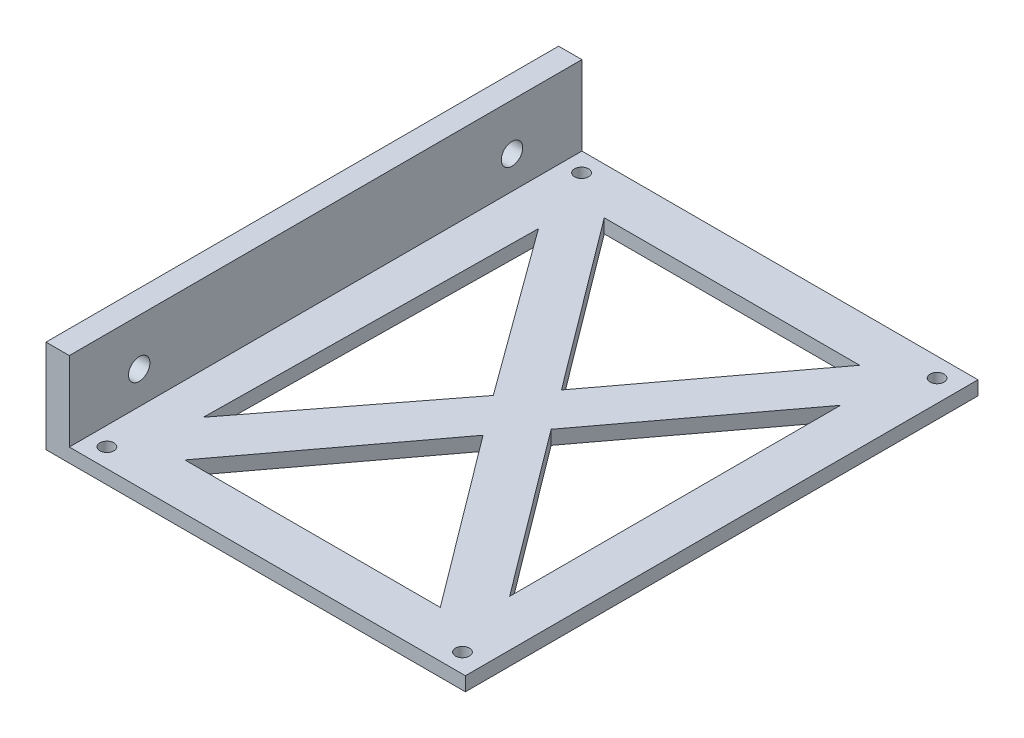
ISO-10303-21;
HEADER;
FILE_DESCRIPTION(('STEP AP214'),'2;1');
FILE_NAME('part.step','',(''),(''),'','','');
FILE_SCHEMA(('AUTOMOTIVE_DESIGN { 1 0 10303 214 1 1 1 1 }'));
ENDSEC;
DATA;
#1=APPLICATION_CONTEXT('core data for automotive mechanical design processes');
#2=APPLICATION_PROTOCOL_DEFINITION('international standard','automotive_design',2000,#1);
#3=PRODUCT_CONTEXT('',#1,'mechanical');
#4=PRODUCT('Part','Part','',(#3));
#5=PRODUCT_RELATED_PRODUCT_CATEGORY('part','',(#4));
#6=PRODUCT_DEFINITION_FORMATION('','',#4);
#7=PRODUCT_DEFINITION_CONTEXT('part definition',#1,'design');
#8=PRODUCT_DEFINITION('design','',#6,#7);
#9=PRODUCT_DEFINITION_SHAPE('','',#8);
#10=(LENGTH_UNIT() NAMED_UNIT(*) SI_UNIT(.MILLI.,.METRE.));
#11=(NAMED_UNIT(*) PLANE_ANGLE_UNIT() SI_UNIT($,.RADIAN.));
#12=(NAMED_UNIT(*) SI_UNIT($,.STERADIAN.) SOLID_ANGLE_UNIT());
#13=UNCERTAINTY_MEASURE_WITH_UNIT(LENGTH_MEASURE(1.E-05),#10,'distance_accuracy_value','');
#14=(GEOMETRIC_REPRESENTATION_CONTEXT(3) GLOBAL_UNCERTAINTY_ASSIGNED_CONTEXT((#13)) GLOBAL_UNIT_ASSIGNED_CONTEXT((#10,
#11,#12)) REPRESENTATION_CONTEXT('',''));
#15=CARTESIAN_POINT('',(0.,0.,0.));
#16=DIRECTION('',(0.,0.,1.));
#17=DIRECTION('',(1.,0.,0.));
#18=AXIS2_PLACEMENT_3D('',#15,#16,#17);
#19=CARTESIAN_POINT('',(5.,0.,0.));
#20=DIRECTION('',(-1.,0.,0.));
#21=DIRECTION('',(0.,0.,1.));
#22=AXIS2_PLACEMENT_3D('',#19,#20,#21);
#23=PLANE('',#22);
#24=CARTESIAN_POINT('',(5.,0.,-40.));
#25=DIRECTION('',(-1.,0.,0.));
#26=DIRECTION('',(0.,0.,1.));
#27=AXIS2_PLACEMENT_3D('',#24,#25,#26);
#28=CIRCLE('',#27,2.29999999999999);
#29=CARTESIAN_POINT('',(5.,0.,-37.7));
#30=VERTEX_POINT('',#29);
#31=EDGE_CURVE('E285',#30,#30,#28,.F.);
#32=ORIENTED_EDGE('',*,*,#31,.F.);
#33=EDGE_LOOP('',(#32));
#34=FACE_BOUND('',#33,.T.);
#35=CARTESIAN_POINT('',(5.,0.,40.));
#36=DIRECTION('',(-1.,0.,0.));
#37=DIRECTION('',(0.,0.,1.));
#38=AXIS2_PLACEMENT_3D('',#35,#36,#37);
#39=CIRCLE('',#38,2.29999999999999);
#40=CARTESIAN_POINT('',(5.,0.,42.3));
#41=VERTEX_POINT('',#40);
#42=EDGE_CURVE('E279',#41,#41,#39,.F.);
#43=ORIENTED_EDGE('',*,*,#42,.F.);
#44=EDGE_LOOP('',(#43));
#45=FACE_BOUND('',#44,.T.);
#46=DIRECTION('',(0.,0.,1.));
#47=VECTOR('',#46,1.);
#48=CARTESIAN_POINT('',(5.,-7.,-55.));
#49=LINE('',#48,#47);
#50=CARTESIAN_POINT('',(5.,-7.,-55.));
#51=VERTEX_POINT('',#50);
#52=CARTESIAN_POINT('',(5.00000000000001,-7.,55.));
#53=VERTEX_POINT('',#52);
#54=EDGE_CURVE('E289',#51,#53,#49,.T.);
#55=ORIENTED_EDGE('',*,*,#54,.F.);
#56=DIRECTION('',(0.,1.,0.));
#57=VECTOR('',#56,1.);
#58=CARTESIAN_POINT('',(5.,-10.,-55.));
#59=LINE('',#58,#57);
#60=CARTESIAN_POINT('',(5.,10.,-55.));
#61=VERTEX_POINT('',#60);
#62=EDGE_CURVE('E308',#51,#61,#59,.T.);
#63=ORIENTED_EDGE('',*,*,#62,.T.);
#64=DIRECTION('',(0.,0.,1.));
#65=VECTOR('',#64,1.);
#66=CARTESIAN_POINT('',(5.,10.,55.));
#67=LINE('',#66,#65);
#68=CARTESIAN_POINT('',(5.,10.,55.));
#69=VERTEX_POINT('',#68);
#70=EDGE_CURVE('E310',#61,#69,#67,.T.);
#71=ORIENTED_EDGE('',*,*,#70,.T.);
#72=DIRECTION('',(0.,-1.,0.));
#73=VECTOR('',#72,1.);
#74=CARTESIAN_POINT('',(5.,-10.,55.));
#75=LINE('',#74,#73);
#76=EDGE_CURVE('E313',#69,#53,#75,.T.);
#77=ORIENTED_EDGE('',*,*,#76,.T.);
#78=EDGE_LOOP('',(#55,#63,#71,#77));
#79=FACE_BOUND('',#78,.T.);
#80=ADVANCED_FACE('F33',(#34,#45,#79),#23,.F.);
#81=CARTESIAN_POINT('',(5.,-10.,-55.));
#82=DIRECTION('',(0.,0.,1.));
#83=DIRECTION('',(1.,0.,0.));
#84=AXIS2_PLACEMENT_3D('',#81,#82,#83);
#85=PLANE('',#84);
#86=DIRECTION('',(0.,1.,0.));
#87=VECTOR('',#86,1.);
#88=CARTESIAN_POINT('',(0.,-10.,-55.));
#89=LINE('',#88,#87);
#90=CARTESIAN_POINT('',(0.,-10.,-55.));
#91=VERTEX_POINT('',#90);
#92=CARTESIAN_POINT('',(0.,10.,-55.));
#93=VERTEX_POINT('',#92);
#94=EDGE_CURVE('E307',#91,#93,#89,.T.);
#95=ORIENTED_EDGE('',*,*,#94,.T.);
#96=DIRECTION('',(-1.,0.,0.));
#97=VECTOR('',#96,1.);
#98=CARTESIAN_POINT('',(5.,10.,-55.));
#99=LINE('',#98,#97);
#100=EDGE_CURVE('E11',#61,#93,#99,.T.);
#101=ORIENTED_EDGE('',*,*,#100,.F.);
#102=ORIENTED_EDGE('',*,*,#62,.F.);
#103=DIRECTION('',(-1.,0.,0.));
#104=VECTOR('',#103,1.);
#105=CARTESIAN_POINT('',(5.,-7.,-55.));
#106=LINE('',#105,#104);
#107=CARTESIAN_POINT('',(90.,-7.,-55.));
#108=VERTEX_POINT('',#107);
#109=EDGE_CURVE('E296',#108,#51,#106,.T.);
#110=ORIENTED_EDGE('',*,*,#109,.F.);
#111=DIRECTION('',(0.,-1.,0.));
#112=VECTOR('',#111,1.);
#113=CARTESIAN_POINT('',(90.,-7.,-55.));
#114=LINE('',#113,#112);
#115=CARTESIAN_POINT('',(90.,-10.,-55.));
#116=VERTEX_POINT('',#115);
#117=EDGE_CURVE('E299',#108,#116,#114,.T.);
#118=ORIENTED_EDGE('',*,*,#117,.T.);
#119=DIRECTION('',(-1.,0.,0.));
#120=VECTOR('',#119,1.);
#121=CARTESIAN_POINT('',(5.,-10.,-55.));
#122=LINE('',#121,#120);
#123=EDGE_CURVE('E315',#116,#91,#122,.T.);
#124=ORIENTED_EDGE('',*,*,#123,.T.);
#125=EDGE_LOOP('',(#95,#101,#102,#110,#118,#124));
#126=FACE_BOUND('',#125,.T.);
#127=ADVANCED_FACE('F35',(#126),#85,.F.);
#128=CARTESIAN_POINT('',(5.,10.,55.));
#129=DIRECTION('',(0.,-1.,0.));
#130=DIRECTION('',(0.,0.,-1.));
#131=AXIS2_PLACEMENT_3D('',#128,#129,#130);
#132=PLANE('',#131);
#133=DIRECTION('',(0.,0.,1.));
#134=VECTOR('',#133,1.);
#135=CARTESIAN_POINT('',(0.,10.,55.));
#136=LINE('',#135,#134);
#137=CARTESIAN_POINT('',(0.,10.,55.));
#138=VERTEX_POINT('',#137);
#139=EDGE_CURVE('E318',#93,#138,#136,.T.);
#140=ORIENTED_EDGE('',*,*,#139,.T.);
#141=DIRECTION('',(-1.,0.,0.));
#142=VECTOR('',#141,1.);
#143=CARTESIAN_POINT('',(5.,10.,55.));
#144=LINE('',#143,#142);
#145=EDGE_CURVE('E42',#69,#138,#144,.T.);
#146=ORIENTED_EDGE('',*,*,#145,.F.);
#147=ORIENTED_EDGE('',*,*,#70,.F.);
#148=ORIENTED_EDGE('',*,*,#100,.T.);
#149=EDGE_LOOP('',(#140,#146,#147,#148));
#150=FACE_BOUND('',#149,.T.);
#151=ADVANCED_FACE('F366',(#150),#132,.F.);
#152=CARTESIAN_POINT('',(5.,-10.,55.));
#153=DIRECTION('',(0.,0.,-1.));
#154=DIRECTION('',(-1.,0.,0.));
#155=AXIS2_PLACEMENT_3D('',#152,#153,#154);
#156=PLANE('',#155);
#157=DIRECTION('',(0.,-1.,0.));
#158=VECTOR('',#157,1.);
#159=CARTESIAN_POINT('',(0.,-10.,55.));
#160=LINE('',#159,#158);
#161=CARTESIAN_POINT('',(0.,-10.,55.));
#162=VERTEX_POINT('',#161);
#163=EDGE_CURVE('E320',#138,#162,#160,.T.);
#164=ORIENTED_EDGE('',*,*,#163,.T.);
#165=DIRECTION('',(-1.,0.,0.));
#166=VECTOR('',#165,1.);
#167=CARTESIAN_POINT('',(5.,-10.,55.));
#168=LINE('',#167,#166);
#169=CARTESIAN_POINT('',(90.,-10.,55.));
#170=VERTEX_POINT('',#169);
#171=EDGE_CURVE('E325',#170,#162,#168,.T.);
#172=ORIENTED_EDGE('',*,*,#171,.F.);
#173=DIRECTION('',(0.,-1.,0.));
#174=VECTOR('',#173,1.);
#175=CARTESIAN_POINT('',(90.,-7.,55.));
#176=LINE('',#175,#174);
#177=CARTESIAN_POINT('',(90.,-7.,55.));
#178=VERTEX_POINT('',#177);
#179=EDGE_CURVE('E304',#178,#170,#176,.T.);
#180=ORIENTED_EDGE('',*,*,#179,.F.);
#181=DIRECTION('',(1.,0.,0.));
#182=VECTOR('',#181,1.);
#183=CARTESIAN_POINT('',(5.00000000000001,-7.,55.));
#184=LINE('',#183,#182);
#185=EDGE_CURVE('E292',#53,#178,#184,.T.);
#186=ORIENTED_EDGE('',*,*,#185,.F.);
#187=ORIENTED_EDGE('',*,*,#76,.F.);
#188=ORIENTED_EDGE('',*,*,#145,.T.);
#189=EDGE_LOOP('',(#164,#172,#180,#186,#187,#188));
#190=FACE_BOUND('',#189,.T.);
#191=ADVANCED_FACE('F370',(#190),#156,.F.);
#192=CARTESIAN_POINT('',(5.,-10.,55.));
#193=DIRECTION('',(0.,1.,0.));
#194=DIRECTION('',(0.,0.,1.));
#195=AXIS2_PLACEMENT_3D('',#192,#193,#194);
#196=PLANE('',#195);
#197=DIRECTION('',(0.599559865294037,0.,-0.800329911929197));
#198=VECTOR('',#197,1.);
#199=CARTESIAN_POINT('',(1.60509110825612,-10.,52.4567349195871));
#200=LINE('',#199,#198);
#201=CARTESIAN_POINT('',(47.2035238953294,-10.,-8.41089783746939));
#202=VERTEX_POINT('',#201);
#203=CARTESIAN_POINT('',(74.6139165806616,-10.,-45.));
#204=VERTEX_POINT('',#203);
#205=EDGE_CURVE('E257',#202,#204,#200,.T.);
#206=ORIENTED_EDGE('',*,*,#205,.T.);
#207=DIRECTION('',(-1.,0.,0.));
#208=VECTOR('',#207,1.);
#209=CARTESIAN_POINT('',(4.99999999999999,-10.,-45.));
#210=LINE('',#209,#208);
#211=CARTESIAN_POINT('',(19.7931312099972,-10.,-45.));
#212=VERTEX_POINT('',#211);
#213=EDGE_CURVE('E260',#204,#212,#210,.T.);
#214=ORIENTED_EDGE('',*,*,#213,.T.);
#215=DIRECTION('',(0.599559865294037,0.,0.800329911929197));
#216=VECTOR('',#215,1.);
#217=CARTESIAN_POINT('',(62.4599836919464,-10.,11.9543764781983));
#218=LINE('',#217,#216);
#219=EDGE_CURVE('E254',#212,#202,#218,.T.);
#220=ORIENTED_EDGE('',*,*,#219,.T.);
#221=EDGE_LOOP('',(#206,#214,#220));
#222=FACE_BOUND('',#221,.T.);
#223=DIRECTION('',(0.609696912452385,0.,-0.792634641525356));
#224=VECTOR('',#223,1.);
#225=CARTESIAN_POINT('',(0.938714441103689,-10.,51.8760471267299));
#226=LINE('',#225,#224);
#227=CARTESIAN_POINT('',(13.8507234089315,-10.,35.0898286129767));
#228=VERTEX_POINT('',#227);
#229=CARTESIAN_POINT('',(40.9030823436684,-10.,-0.079509444520881));
#230=VERTEX_POINT('',#229);
#231=EDGE_CURVE('E248',#228,#230,#226,.T.);
#232=ORIENTED_EDGE('',*,*,#231,.T.);
#233=DIRECTION('',(-0.589325703280344,0.,-0.807895547365579));
#234=VECTOR('',#233,1.);
#235=CARTESIAN_POINT('',(54.6578742340768,-10.,18.7766766361919));
#236=LINE('',#235,#234);
#237=CARTESIAN_POINT('',(14.7545975326171,-10.,-35.9259765706214));
#238=VERTEX_POINT('',#237);
#239=EDGE_CURVE('E251',#230,#238,#236,.T.);
#240=ORIENTED_EDGE('',*,*,#239,.T.);
#241=DIRECTION('',(-0.0127267573461906,0.,0.999919011544161));
#242=VECTOR('',#241,1.);
#243=CARTESIAN_POINT('',(13.5959184559973,-10.,55.1094070290635));
#244=LINE('',#243,#242);
#245=EDGE_CURVE('E245',#238,#228,#244,.T.);
#246=ORIENTED_EDGE('',*,*,#245,.T.);
#247=EDGE_LOOP('',(#232,#240,#246));
#248=FACE_BOUND('',#247,.T.);
#249=DIRECTION('',(-0.599559865294037,0.,-0.800329911929197));
#250=VECTOR('',#249,1.);
#251=CARTESIAN_POINT('',(54.3881174688325,-10.,18.0013415525585));
#252=LINE('',#251,#250);
#253=CARTESIAN_POINT('',(74.6139165806616,-10.,45.));
#254=VERTEX_POINT('',#253);
#255=CARTESIAN_POINT('',(47.2035238953294,-10.,8.41089783746943));
#256=VERTEX_POINT('',#255);
#257=EDGE_CURVE('E168',#254,#256,#252,.T.);
#258=ORIENTED_EDGE('',*,*,#257,.T.);
#259=DIRECTION('',(-0.599559865294037,0.,0.800329911929197));
#260=VECTOR('',#259,1.);
#261=CARTESIAN_POINT('',(9.67695733136999,-10.,58.5036999939473));
#262=LINE('',#261,#260);
#263=CARTESIAN_POINT('',(19.7931312099972,-10.,45.));
#264=VERTEX_POINT('',#263);
#265=EDGE_CURVE('E242',#256,#264,#262,.T.);
#266=ORIENTED_EDGE('',*,*,#265,.T.);
#267=DIRECTION('',(1.,0.,0.));
#268=VECTOR('',#267,1.);
#269=CARTESIAN_POINT('',(5.,-10.,45.));
#270=LINE('',#269,#268);
#271=EDGE_CURVE('E239',#264,#254,#270,.T.);
#272=ORIENTED_EDGE('',*,*,#271,.T.);
#273=EDGE_LOOP('',(#258,#266,#272));
#274=FACE_BOUND('',#273,.T.);
#275=DIRECTION('',(0.599559865294037,0.,0.800329911929197));
#276=VECTOR('',#275,1.);
#277=CARTESIAN_POINT('',(62.3914165881245,-10.,12.0057428996181));
#278=LINE('',#277,#276);
#279=CARTESIAN_POINT('',(53.397423625524,-10.,0.));
#280=VERTEX_POINT('',#279);
#281=CARTESIAN_POINT('',(80.,-10.,35.5107785549199));
#282=VERTEX_POINT('',#281);
#283=EDGE_CURVE('E233',#280,#282,#278,.T.);
#284=ORIENTED_EDGE('',*,*,#283,.T.);
#285=DIRECTION('',(0.,0.,-1.));
#286=VECTOR('',#285,1.);
#287=CARTESIAN_POINT('',(80.,-10.,55.));
#288=LINE('',#287,#286);
#289=CARTESIAN_POINT('',(80.,-10.,-35.5107785549198));
#290=VERTEX_POINT('',#289);
#291=EDGE_CURVE('E236',#282,#290,#288,.T.);
#292=ORIENTED_EDGE('',*,*,#291,.T.);
#293=DIRECTION('',(-0.599559865294038,0.,0.800329911929197));
#294=VECTOR('',#293,1.);
#295=CARTESIAN_POINT('',(9.60839022754808,-10.,58.4523335725275));
#296=LINE('',#295,#294);
#297=EDGE_CURVE('E226',#290,#280,#296,.T.);
#298=ORIENTED_EDGE('',*,*,#297,.T.);
#299=EDGE_LOOP('',(#284,#292,#298));
#300=FACE_BOUND('',#299,.T.);
#301=CARTESIAN_POINT('',(8.99999999999999,-10.,-50.925));
#302=DIRECTION('',(0.,-1.,0.));
#303=DIRECTION('',(0.,0.,-1.));
#304=AXIS2_PLACEMENT_3D('',#301,#302,#303);
#305=CIRCLE('',#304,1.4987948959022);
#306=CARTESIAN_POINT('',(8.99999999999999,-10.,-52.4237948959022));
#307=VERTEX_POINT('',#306);
#308=EDGE_CURVE('E263',#307,#307,#305,.T.);
#309=ORIENTED_EDGE('',*,*,#308,.F.);
#310=EDGE_LOOP('',(#309));
#311=FACE_BOUND('',#310,.T.);
#312=CARTESIAN_POINT('',(85.3,-10.,-50.925));
#313=DIRECTION('',(0.,-1.,0.));
#314=DIRECTION('',(0.,0.,-1.));
#315=AXIS2_PLACEMENT_3D('',#312,#313,#314);
#316=CIRCLE('',#315,1.4987948959022);
#317=CARTESIAN_POINT('',(85.3,-10.,-52.4237948959022));
#318=VERTEX_POINT('',#317);
#319=EDGE_CURVE('E268',#318,#318,#316,.T.);
#320=ORIENTED_EDGE('',*,*,#319,.F.);
#321=EDGE_LOOP('',(#320));
#322=FACE_BOUND('',#321,.T.);
#323=CARTESIAN_POINT('',(85.3,-10.,50.925));
#324=DIRECTION('',(0.,-1.,0.));
#325=DIRECTION('',(0.,0.,-1.));
#326=AXIS2_PLACEMENT_3D('',#323,#324,#325);
#327=CIRCLE('',#326,1.4987948959022);
#328=CARTESIAN_POINT('',(85.3,-10.,49.4262051040978));
#329=VERTEX_POINT('',#328);
#330=EDGE_CURVE('E264',#329,#329,#327,.T.);
#331=ORIENTED_EDGE('',*,*,#330,.F.);
#332=EDGE_LOOP('',(#331));
#333=FACE_BOUND('',#332,.T.);
#334=CARTESIAN_POINT('',(8.99999999999999,-10.,50.925));
#335=DIRECTION('',(0.,-1.,0.));
#336=DIRECTION('',(0.,0.,-1.));
#337=AXIS2_PLACEMENT_3D('',#334,#335,#336);
#338=CIRCLE('',#337,1.4987948959022);
#339=CARTESIAN_POINT('',(8.99999999999999,-10.,49.4262051040978));
#340=VERTEX_POINT('',#339);
#341=EDGE_CURVE('E267',#340,#340,#338,.T.);
#342=ORIENTED_EDGE('',*,*,#341,.F.);
#343=EDGE_LOOP('',(#342));
#344=FACE_BOUND('',#343,.T.);
#345=DIRECTION('',(0.,0.,-1.));
#346=VECTOR('',#345,1.);
#347=CARTESIAN_POINT('',(0.,-10.,55.));
#348=LINE('',#347,#346);
#349=EDGE_CURVE('E311',#162,#91,#348,.T.);
#350=ORIENTED_EDGE('',*,*,#349,.T.);
#351=ORIENTED_EDGE('',*,*,#123,.F.);
#352=DIRECTION('',(0.,0.,-1.));
#353=VECTOR('',#352,1.);
#354=CARTESIAN_POINT('',(90.,-10.,-55.));
#355=LINE('',#354,#353);
#356=EDGE_CURVE('E288',#170,#116,#355,.T.);
#357=ORIENTED_EDGE('',*,*,#356,.F.);
#358=ORIENTED_EDGE('',*,*,#171,.T.);
#359=EDGE_LOOP('',(#350,#351,#357,#358));
#360=FACE_BOUND('',#359,.T.);
#361=ADVANCED_FACE('F379',(#222,#248,#274,#300,#311,#322,#333,#344,#360),#196,.F.);
#362=CARTESIAN_POINT('',(0.,0.,0.));
#363=DIRECTION('',(-1.,0.,0.));
#364=DIRECTION('',(0.,0.,1.));
#365=AXIS2_PLACEMENT_3D('',#362,#363,#364);
#366=PLANE('',#365);
#367=CARTESIAN_POINT('',(0.,0.,-40.));
#368=DIRECTION('',(1.,0.,0.));
#369=DIRECTION('',(0.,0.,-1.));
#370=AXIS2_PLACEMENT_3D('',#367,#368,#369);
#371=CIRCLE('',#370,2.29999999999999);
#372=CARTESIAN_POINT('',(0.,0.,-42.3));
#373=VERTEX_POINT('',#372);
#374=EDGE_CURVE('E276',#373,#373,#371,.T.);
#375=ORIENTED_EDGE('',*,*,#374,.T.);
#376=EDGE_LOOP('',(#375));
#377=FACE_BOUND('',#376,.T.);
#378=CARTESIAN_POINT('',(0.,0.,40.));
#379=DIRECTION('',(1.,0.,0.));
#380=DIRECTION('',(0.,0.,-1.));
#381=AXIS2_PLACEMENT_3D('',#378,#379,#380);
#382=CIRCLE('',#381,2.29999999999999);
#383=CARTESIAN_POINT('',(0.,0.,37.7));
#384=VERTEX_POINT('',#383);
#385=EDGE_CURVE('E280',#384,#384,#382,.T.);
#386=ORIENTED_EDGE('',*,*,#385,.T.);
#387=EDGE_LOOP('',(#386));
#388=FACE_BOUND('',#387,.T.);
#389=ORIENTED_EDGE('',*,*,#94,.F.);
#390=ORIENTED_EDGE('',*,*,#349,.F.);
#391=ORIENTED_EDGE('',*,*,#163,.F.);
#392=ORIENTED_EDGE('',*,*,#139,.F.);
#393=EDGE_LOOP('',(#389,#390,#391,#392));
#394=FACE_BOUND('',#393,.T.);
#395=ADVANCED_FACE('F378',(#377,#388,#394),#366,.T.);
#396=CARTESIAN_POINT('',(90.,-7.,-55.));
#397=DIRECTION('',(-1.,0.,0.));
#398=DIRECTION('',(0.,0.,1.));
#399=AXIS2_PLACEMENT_3D('',#396,#397,#398);
#400=PLANE('',#399);
#401=ORIENTED_EDGE('',*,*,#356,.T.);
#402=ORIENTED_EDGE('',*,*,#117,.F.);
#403=DIRECTION('',(0.,0.,-1.));
#404=VECTOR('',#403,1.);
#405=CARTESIAN_POINT('',(90.,-7.,-55.));
#406=LINE('',#405,#404);
#407=EDGE_CURVE('E294',#178,#108,#406,.T.);
#408=ORIENTED_EDGE('',*,*,#407,.F.);
#409=ORIENTED_EDGE('',*,*,#179,.T.);
#410=EDGE_LOOP('',(#401,#402,#408,#409));
#411=FACE_BOUND('',#410,.T.);
#412=ADVANCED_FACE('F347',(#411),#400,.F.);
#413=CARTESIAN_POINT('',(0.,-7.,0.));
#414=DIRECTION('',(0.,1.,0.));
#415=DIRECTION('',(0.,0.,1.));
#416=AXIS2_PLACEMENT_3D('',#413,#414,#415);
#417=PLANE('',#416);
#418=DIRECTION('',(-1.,0.,0.));
#419=VECTOR('',#418,1.);
#420=CARTESIAN_POINT('',(74.6139165806616,-7.,-45.));
#421=LINE('',#420,#419);
#422=CARTESIAN_POINT('',(74.6139165806616,-7.,-45.));
#423=VERTEX_POINT('',#422);
#424=CARTESIAN_POINT('',(19.7931312099972,-7.,-45.));
#425=VERTEX_POINT('',#424);
#426=EDGE_CURVE('E188',#423,#425,#421,.T.);
#427=ORIENTED_EDGE('',*,*,#426,.F.);
#428=DIRECTION('',(0.599559865294037,0.,-0.800329911929197));
#429=VECTOR('',#428,1.);
#430=CARTESIAN_POINT('',(47.2035238953294,-7.,-8.41089783746939));
#431=LINE('',#430,#429);
#432=CARTESIAN_POINT('',(47.2035238953294,-7.,-8.41089783746939));
#433=VERTEX_POINT('',#432);
#434=EDGE_CURVE('E193',#433,#423,#431,.T.);
#435=ORIENTED_EDGE('',*,*,#434,.F.);
#436=DIRECTION('',(0.599559865294037,0.,0.800329911929197));
#437=VECTOR('',#436,1.);
#438=CARTESIAN_POINT('',(19.7931312099972,-7.,-45.));
#439=LINE('',#438,#437);
#440=EDGE_CURVE('E191',#425,#433,#439,.T.);
#441=ORIENTED_EDGE('',*,*,#440,.F.);
#442=EDGE_LOOP('',(#427,#435,#441));
#443=FACE_BOUND('',#442,.T.);
#444=DIRECTION('',(-0.589325703280343,0.,-0.807895547365579));
#445=VECTOR('',#444,1.);
#446=CARTESIAN_POINT('',(14.7545975326171,-7.,-35.9259765706214));
#447=LINE('',#446,#445);
#448=CARTESIAN_POINT('',(40.9030823436684,-7.,-0.079509444520881));
#449=VERTEX_POINT('',#448);
#450=CARTESIAN_POINT('',(14.7545975326171,-7.,-35.9259765706214));
#451=VERTEX_POINT('',#450);
#452=EDGE_CURVE('E199',#449,#451,#447,.T.);
#453=ORIENTED_EDGE('',*,*,#452,.F.);
#454=DIRECTION('',(0.609696912452385,0.,-0.792634641525356));
#455=VECTOR('',#454,1.);
#456=CARTESIAN_POINT('',(40.9030823436684,-7.,-0.079509444520881));
#457=LINE('',#456,#455);
#458=CARTESIAN_POINT('',(13.8507234089315,-7.,35.0898286129767));
#459=VERTEX_POINT('',#458);
#460=EDGE_CURVE('E206',#459,#449,#457,.T.);
#461=ORIENTED_EDGE('',*,*,#460,.F.);
#462=DIRECTION('',(-0.0127267573461906,0.,0.999919011544161));
#463=VECTOR('',#462,1.);
#464=CARTESIAN_POINT('',(13.8507234089315,-7.,35.0898286129767));
#465=LINE('',#464,#463);
#466=EDGE_CURVE('E204',#451,#459,#465,.T.);
#467=ORIENTED_EDGE('',*,*,#466,.F.);
#468=EDGE_LOOP('',(#453,#461,#467));
#469=FACE_BOUND('',#468,.T.);
#470=DIRECTION('',(-0.599559865294037,0.,0.800329911929197));
#471=VECTOR('',#470,1.);
#472=CARTESIAN_POINT('',(19.7931312099972,-7.,45.));
#473=LINE('',#472,#471);
#474=CARTESIAN_POINT('',(47.2035238953294,-7.,8.41089783746943));
#475=VERTEX_POINT('',#474);
#476=CARTESIAN_POINT('',(19.7931312099972,-7.,45.));
#477=VERTEX_POINT('',#476);
#478=EDGE_CURVE('E180',#475,#477,#473,.T.);
#479=ORIENTED_EDGE('',*,*,#478,.F.);
#480=DIRECTION('',(-0.599559865294037,0.,-0.800329911929197));
#481=VECTOR('',#480,1.);
#482=CARTESIAN_POINT('',(47.2035238953294,-7.,8.41089783746943));
#483=LINE('',#482,#481);
#484=CARTESIAN_POINT('',(74.6139165806616,-7.,45.));
#485=VERTEX_POINT('',#484);
#486=EDGE_CURVE('E165',#485,#475,#483,.T.);
#487=ORIENTED_EDGE('',*,*,#486,.F.);
#488=DIRECTION('',(1.,0.,0.));
#489=VECTOR('',#488,1.);
#490=CARTESIAN_POINT('',(74.6139165806616,-7.,45.));
#491=LINE('',#490,#489);
#492=EDGE_CURVE('E176',#477,#485,#491,.T.);
#493=ORIENTED_EDGE('',*,*,#492,.F.);
#494=EDGE_LOOP('',(#479,#487,#493));
#495=FACE_BOUND('',#494,.T.);
#496=DIRECTION('',(0.,0.,-1.));
#497=VECTOR('',#496,1.);
#498=CARTESIAN_POINT('',(80.,-7.,35.5107785549199));
#499=LINE('',#498,#497);
#500=CARTESIAN_POINT('',(80.,-7.,35.5107785549199));
#501=VERTEX_POINT('',#500);
#502=CARTESIAN_POINT('',(80.,-7.,-35.5107785549198));
#503=VERTEX_POINT('',#502);
#504=EDGE_CURVE('E212',#501,#503,#499,.T.);
#505=ORIENTED_EDGE('',*,*,#504,.F.);
#506=DIRECTION('',(0.599559865294037,0.,0.800329911929197));
#507=VECTOR('',#506,1.);
#508=CARTESIAN_POINT('',(53.397423625524,-7.,0.));
#509=LINE('',#508,#507);
#510=CARTESIAN_POINT('',(53.397423625524,-7.,0.));
#511=VERTEX_POINT('',#510);
#512=EDGE_CURVE('E220',#511,#501,#509,.T.);
#513=ORIENTED_EDGE('',*,*,#512,.F.);
#514=DIRECTION('',(-0.599559865294038,0.,0.800329911929197));
#515=VECTOR('',#514,1.);
#516=CARTESIAN_POINT('',(80.,-7.,-35.5107785549198));
#517=LINE('',#516,#515);
#518=EDGE_CURVE('E217',#503,#511,#517,.T.);
#519=ORIENTED_EDGE('',*,*,#518,.F.);
#520=EDGE_LOOP('',(#505,#513,#519));
#521=FACE_BOUND('',#520,.T.);
#522=CARTESIAN_POINT('',(8.99999999999999,-7.,-50.925));
#523=DIRECTION('',(0.,1.,0.));
#524=DIRECTION('',(0.,0.,1.));
#525=AXIS2_PLACEMENT_3D('',#522,#523,#524);
#526=CIRCLE('',#525,1.4987948959022);
#527=CARTESIAN_POINT('',(8.99999999999999,-7.,-49.4262051040978));
#528=VERTEX_POINT('',#527);
#529=EDGE_CURVE('E37',#528,#528,#526,.T.);
#530=ORIENTED_EDGE('',*,*,#529,.F.);
#531=EDGE_LOOP('',(#530));
#532=FACE_BOUND('',#531,.T.);
#533=CARTESIAN_POINT('',(85.3,-7.,-50.925));
#534=DIRECTION('',(0.,1.,0.));
#535=DIRECTION('',(0.,0.,1.));
#536=AXIS2_PLACEMENT_3D('',#533,#534,#535);
#537=CIRCLE('',#536,1.4987948959022);
#538=CARTESIAN_POINT('',(85.3,-7.,-49.4262051040978));
#539=VERTEX_POINT('',#538);
#540=EDGE_CURVE('E334',#539,#539,#537,.T.);
#541=ORIENTED_EDGE('',*,*,#540,.F.);
#542=EDGE_LOOP('',(#541));
#543=FACE_BOUND('',#542,.T.);
#544=CARTESIAN_POINT('',(85.3,-7.,50.925));
#545=DIRECTION('',(0.,1.,0.));
#546=DIRECTION('',(0.,0.,1.));
#547=AXIS2_PLACEMENT_3D('',#544,#545,#546);
#548=CIRCLE('',#547,1.4987948959022);
#549=CARTESIAN_POINT('',(85.3,-7.,52.4237948959022));
#550=VERTEX_POINT('',#549);
#551=EDGE_CURVE('E332',#550,#550,#548,.T.);
#552=ORIENTED_EDGE('',*,*,#551,.F.);
#553=EDGE_LOOP('',(#552));
#554=FACE_BOUND('',#553,.T.);
#555=CARTESIAN_POINT('',(8.99999999999999,-7.,50.925));
#556=DIRECTION('',(0.,1.,0.));
#557=DIRECTION('',(0.,0.,1.));
#558=AXIS2_PLACEMENT_3D('',#555,#556,#557);
#559=CIRCLE('',#558,1.4987948959022);
#560=CARTESIAN_POINT('',(8.99999999999999,-7.,52.4237948959022));
#561=VERTEX_POINT('',#560);
#562=EDGE_CURVE('E275',#561,#561,#559,.T.);
#563=ORIENTED_EDGE('',*,*,#562,.F.);
#564=EDGE_LOOP('',(#563));
#565=FACE_BOUND('',#564,.T.);
#566=ORIENTED_EDGE('',*,*,#54,.T.);
#567=ORIENTED_EDGE('',*,*,#185,.T.);
#568=ORIENTED_EDGE('',*,*,#407,.T.);
#569=ORIENTED_EDGE('',*,*,#109,.T.);
#570=EDGE_LOOP('',(#566,#567,#568,#569));
#571=FACE_BOUND('',#570,.T.);
#572=ADVANCED_FACE('F182',(#443,#469,#495,#521,#532,#543,#554,#565,#571),#417,.T.);
#573=CARTESIAN_POINT('',(10.,0.,40.));
#574=DIRECTION('',(-1.,0.,0.));
#575=DIRECTION('',(0.,0.,1.));
#576=AXIS2_PLACEMENT_3D('',#573,#574,#575);
#577=CYLINDRICAL_SURFACE('',#576,2.29999999999999);
#578=ORIENTED_EDGE('',*,*,#385,.F.);
#579=EDGE_LOOP('',(#578));
#580=FACE_BOUND('',#579,.T.);
#581=ORIENTED_EDGE('',*,*,#42,.T.);
#582=EDGE_LOOP('',(#581));
#583=FACE_BOUND('',#582,.T.);
#584=ADVANCED_FACE('F346',(#580,#583),#577,.F.);
#585=CARTESIAN_POINT('',(10.,0.,-40.));
#586=DIRECTION('',(-1.,0.,0.));
#587=DIRECTION('',(0.,0.,1.));
#588=AXIS2_PLACEMENT_3D('',#585,#586,#587);
#589=CYLINDRICAL_SURFACE('',#588,2.29999999999999);
#590=ORIENTED_EDGE('',*,*,#374,.F.);
#591=EDGE_LOOP('',(#590));
#592=FACE_BOUND('',#591,.T.);
#593=ORIENTED_EDGE('',*,*,#31,.T.);
#594=EDGE_LOOP('',(#593));
#595=FACE_BOUND('',#594,.T.);
#596=ADVANCED_FACE('F404',(#592,#595),#589,.F.);
#597=CARTESIAN_POINT('',(8.99999999999999,0.,50.925));
#598=DIRECTION('',(0.,-1.,0.));
#599=DIRECTION('',(0.,0.,-1.));
#600=AXIS2_PLACEMENT_3D('',#597,#598,#599);
#601=CYLINDRICAL_SURFACE('',#600,1.4987948959022);
#602=ORIENTED_EDGE('',*,*,#562,.T.);
#603=EDGE_LOOP('',(#602));
#604=FACE_BOUND('',#603,.T.);
#605=ORIENTED_EDGE('',*,*,#341,.T.);
#606=EDGE_LOOP('',(#605));
#607=FACE_BOUND('',#606,.T.);
#608=ADVANCED_FACE('F408',(#604,#607),#601,.F.);
#609=CARTESIAN_POINT('',(85.3,0.,50.925));
#610=DIRECTION('',(0.,-1.,0.));
#611=DIRECTION('',(0.,0.,-1.));
#612=AXIS2_PLACEMENT_3D('',#609,#610,#611);
#613=CYLINDRICAL_SURFACE('',#612,1.4987948959022);
#614=ORIENTED_EDGE('',*,*,#551,.T.);
#615=EDGE_LOOP('',(#614));
#616=FACE_BOUND('',#615,.T.);
#617=ORIENTED_EDGE('',*,*,#330,.T.);
#618=EDGE_LOOP('',(#617));
#619=FACE_BOUND('',#618,.T.);
#620=ADVANCED_FACE('F412',(#616,#619),#613,.F.);
#621=CARTESIAN_POINT('',(85.3,0.,-50.925));
#622=DIRECTION('',(0.,-1.,0.));
#623=DIRECTION('',(0.,0.,-1.));
#624=AXIS2_PLACEMENT_3D('',#621,#622,#623);
#625=CYLINDRICAL_SURFACE('',#624,1.4987948959022);
#626=ORIENTED_EDGE('',*,*,#540,.T.);
#627=EDGE_LOOP('',(#626));
#628=FACE_BOUND('',#627,.T.);
#629=ORIENTED_EDGE('',*,*,#319,.T.);
#630=EDGE_LOOP('',(#629));
#631=FACE_BOUND('',#630,.T.);
#632=ADVANCED_FACE('F417',(#628,#631),#625,.F.);
#633=CARTESIAN_POINT('',(8.99999999999999,0.,-50.925));
#634=DIRECTION('',(0.,-1.,0.));
#635=DIRECTION('',(0.,0.,-1.));
#636=AXIS2_PLACEMENT_3D('',#633,#634,#635);
#637=CYLINDRICAL_SURFACE('',#636,1.4987948959022);
#638=ORIENTED_EDGE('',*,*,#529,.T.);
#639=EDGE_LOOP('',(#638));
#640=FACE_BOUND('',#639,.T.);
#641=ORIENTED_EDGE('',*,*,#308,.T.);
#642=EDGE_LOOP('',(#641));
#643=FACE_BOUND('',#642,.T.);
#644=ADVANCED_FACE('F341',(#640,#643),#637,.F.);
#645=CARTESIAN_POINT('',(80.,-17.,35.5107785549199));
#646=DIRECTION('',(1.,0.,0.));
#647=DIRECTION('',(0.,0.,-1.));
#648=AXIS2_PLACEMENT_3D('',#645,#646,#647);
#649=PLANE('',#648);
#650=DIRECTION('',(0.,1.,0.));
#651=VECTOR('',#650,1.);
#652=CARTESIAN_POINT('',(80.,-17.,35.5107785549199));
#653=LINE('',#652,#651);
#654=EDGE_CURVE('E224',#282,#501,#653,.T.);
#655=ORIENTED_EDGE('',*,*,#654,.T.);
#656=ORIENTED_EDGE('',*,*,#504,.T.);
#657=DIRECTION('',(0.,1.,0.));
#658=VECTOR('',#657,1.);
#659=CARTESIAN_POINT('',(80.,-17.,-35.5107785549198));
#660=LINE('',#659,#658);
#661=EDGE_CURVE('E223',#290,#503,#660,.T.);
#662=ORIENTED_EDGE('',*,*,#661,.F.);
#663=ORIENTED_EDGE('',*,*,#291,.F.);
#664=EDGE_LOOP('',(#655,#656,#662,#663));
#665=FACE_BOUND('',#664,.T.);
#666=ADVANCED_FACE('F416',(#665),#649,.F.);
#667=CARTESIAN_POINT('',(53.397423625524,-17.,0.));
#668=DIRECTION('',(-0.800329911929197,0.,0.599559865294037));
#669=DIRECTION('',(0.599559865294037,0.,0.800329911929197));
#670=AXIS2_PLACEMENT_3D('',#667,#668,#669);
#671=PLANE('',#670);
#672=DIRECTION('',(0.,1.,0.));
#673=VECTOR('',#672,1.);
#674=CARTESIAN_POINT('',(53.397423625524,-17.,0.));
#675=LINE('',#674,#673);
#676=EDGE_CURVE('E227',#280,#511,#675,.T.);
#677=ORIENTED_EDGE('',*,*,#676,.T.);
#678=ORIENTED_EDGE('',*,*,#512,.T.);
#679=ORIENTED_EDGE('',*,*,#654,.F.);
#680=ORIENTED_EDGE('',*,*,#283,.F.);
#681=EDGE_LOOP('',(#677,#678,#679,#680));
#682=FACE_BOUND('',#681,.T.);
#683=ADVANCED_FACE('F425',(#682),#671,.F.);
#684=CARTESIAN_POINT('',(80.,-17.,-35.5107785549198));
#685=DIRECTION('',(-0.800329911929197,0.,-0.599559865294038));
#686=DIRECTION('',(-0.599559865294038,0.,0.800329911929197));
#687=AXIS2_PLACEMENT_3D('',#684,#685,#686);
#688=PLANE('',#687);
#689=ORIENTED_EDGE('',*,*,#661,.T.);
#690=ORIENTED_EDGE('',*,*,#518,.T.);
#691=ORIENTED_EDGE('',*,*,#676,.F.);
#692=ORIENTED_EDGE('',*,*,#297,.F.);
#693=EDGE_LOOP('',(#689,#690,#691,#692));
#694=FACE_BOUND('',#693,.T.);
#695=ADVANCED_FACE('F427',(#694),#688,.F.);
#696=CARTESIAN_POINT('',(19.7931312099972,-17.,45.));
#697=DIRECTION('',(-0.800329911929197,0.,-0.599559865294037));
#698=DIRECTION('',(-0.599559865294037,0.,0.800329911929197));
#699=AXIS2_PLACEMENT_3D('',#696,#697,#698);
#700=PLANE('',#699);
#701=DIRECTION('',(0.,1.,0.));
#702=VECTOR('',#701,1.);
#703=CARTESIAN_POINT('',(47.2035238953294,-17.,8.41089783746943));
#704=LINE('',#703,#702);
#705=EDGE_CURVE('E171',#256,#475,#704,.T.);
#706=ORIENTED_EDGE('',*,*,#705,.T.);
#707=ORIENTED_EDGE('',*,*,#478,.T.);
#708=DIRECTION('',(0.,1.,0.));
#709=VECTOR('',#708,1.);
#710=CARTESIAN_POINT('',(19.7931312099972,-17.,45.));
#711=LINE('',#710,#709);
#712=EDGE_CURVE('E172',#264,#477,#711,.T.);
#713=ORIENTED_EDGE('',*,*,#712,.F.);
#714=ORIENTED_EDGE('',*,*,#265,.F.);
#715=EDGE_LOOP('',(#706,#707,#713,#714));
#716=FACE_BOUND('',#715,.T.);
#717=ADVANCED_FACE('F430',(#716),#700,.F.);
#718=CARTESIAN_POINT('',(47.2035238953294,-17.,8.41089783746943));
#719=DIRECTION('',(0.800329911929197,0.,-0.599559865294037));
#720=DIRECTION('',(-0.599559865294037,0.,-0.800329911929197));
#721=AXIS2_PLACEMENT_3D('',#718,#719,#720);
#722=PLANE('',#721);
#723=DIRECTION('',(0.,1.,0.));
#724=VECTOR('',#723,1.);
#725=CARTESIAN_POINT('',(74.6139165806616,-17.,45.));
#726=LINE('',#725,#724);
#727=EDGE_CURVE('E160',#254,#485,#726,.T.);
#728=ORIENTED_EDGE('',*,*,#727,.T.);
#729=ORIENTED_EDGE('',*,*,#486,.T.);
#730=ORIENTED_EDGE('',*,*,#705,.F.);
#731=ORIENTED_EDGE('',*,*,#257,.F.);
#732=EDGE_LOOP('',(#728,#729,#730,#731));
#733=FACE_BOUND('',#732,.T.);
#734=ADVANCED_FACE('F162',(#733),#722,.F.);
#735=CARTESIAN_POINT('',(74.6139165806616,-17.,45.));
#736=DIRECTION('',(0.,0.,1.));
#737=DIRECTION('',(1.,0.,0.));
#738=AXIS2_PLACEMENT_3D('',#735,#736,#737);
#739=PLANE('',#738);
#740=ORIENTED_EDGE('',*,*,#712,.T.);
#741=ORIENTED_EDGE('',*,*,#492,.T.);
#742=ORIENTED_EDGE('',*,*,#727,.F.);
#743=ORIENTED_EDGE('',*,*,#271,.F.);
#744=EDGE_LOOP('',(#740,#741,#742,#743));
#745=FACE_BOUND('',#744,.T.);
#746=ADVANCED_FACE('F177',(#745),#739,.F.);
#747=CARTESIAN_POINT('',(14.7545975326171,-17.,-35.9259765706214));
#748=DIRECTION('',(0.807895547365579,0.,-0.589325703280343));
#749=DIRECTION('',(-0.589325703280344,0.,-0.807895547365579));
#750=AXIS2_PLACEMENT_3D('',#747,#748,#749);
#751=PLANE('',#750);
#752=DIRECTION('',(0.,1.,0.));
#753=VECTOR('',#752,1.);
#754=CARTESIAN_POINT('',(40.9030823436684,-17.,-0.079509444520881));
#755=LINE('',#754,#753);
#756=EDGE_CURVE('E210',#230,#449,#755,.T.);
#757=ORIENTED_EDGE('',*,*,#756,.T.);
#758=ORIENTED_EDGE('',*,*,#452,.T.);
#759=DIRECTION('',(0.,1.,0.));
#760=VECTOR('',#759,1.);
#761=CARTESIAN_POINT('',(14.7545975326171,-17.,-35.9259765706214));
#762=LINE('',#761,#760);
#763=EDGE_CURVE('E209',#238,#451,#762,.T.);
#764=ORIENTED_EDGE('',*,*,#763,.F.);
#765=ORIENTED_EDGE('',*,*,#239,.F.);
#766=EDGE_LOOP('',(#757,#758,#764,#765));
#767=FACE_BOUND('',#766,.T.);
#768=ADVANCED_FACE('F435',(#767),#751,.F.);
#769=CARTESIAN_POINT('',(40.9030823436684,-17.,-0.079509444520881));
#770=DIRECTION('',(0.792634641525356,0.,0.609696912452385));
#771=DIRECTION('',(0.609696912452385,0.,-0.792634641525356));
#772=AXIS2_PLACEMENT_3D('',#769,#770,#771);
#773=PLANE('',#772);
#774=DIRECTION('',(0.,1.,0.));
#775=VECTOR('',#774,1.);
#776=CARTESIAN_POINT('',(13.8507234089315,-17.,35.0898286129767));
#777=LINE('',#776,#775);
#778=EDGE_CURVE('E58',#228,#459,#777,.T.);
#779=ORIENTED_EDGE('',*,*,#778,.T.);
#780=ORIENTED_EDGE('',*,*,#460,.T.);
#781=ORIENTED_EDGE('',*,*,#756,.F.);
#782=ORIENTED_EDGE('',*,*,#231,.F.);
#783=EDGE_LOOP('',(#779,#780,#781,#782));
#784=FACE_BOUND('',#783,.T.);
#785=ADVANCED_FACE('F438',(#784),#773,.F.);
#786=CARTESIAN_POINT('',(13.8507234089315,-17.,35.0898286129767));
#787=DIRECTION('',(-0.999919011544161,0.,-0.0127267573461906));
#788=DIRECTION('',(-0.0127267573461906,0.,0.999919011544161));
#789=AXIS2_PLACEMENT_3D('',#786,#787,#788);
#790=PLANE('',#789);
#791=ORIENTED_EDGE('',*,*,#763,.T.);
#792=ORIENTED_EDGE('',*,*,#466,.T.);
#793=ORIENTED_EDGE('',*,*,#778,.F.);
#794=ORIENTED_EDGE('',*,*,#245,.F.);
#795=EDGE_LOOP('',(#791,#792,#793,#794));
#796=FACE_BOUND('',#795,.T.);
#797=ADVANCED_FACE('F440',(#796),#790,.F.);
#798=CARTESIAN_POINT('',(74.6139165806616,-17.,-45.));
#799=DIRECTION('',(0.,0.,-1.));
#800=DIRECTION('',(-1.,0.,0.));
#801=AXIS2_PLACEMENT_3D('',#798,#799,#800);
#802=PLANE('',#801);
#803=DIRECTION('',(0.,1.,0.));
#804=VECTOR('',#803,1.);
#805=CARTESIAN_POINT('',(74.6139165806616,-17.,-45.));
#806=LINE('',#805,#804);
#807=EDGE_CURVE('E197',#204,#423,#806,.T.);
#808=ORIENTED_EDGE('',*,*,#807,.T.);
#809=ORIENTED_EDGE('',*,*,#426,.T.);
#810=DIRECTION('',(0.,1.,0.));
#811=VECTOR('',#810,1.);
#812=CARTESIAN_POINT('',(19.7931312099972,-17.,-45.));
#813=LINE('',#812,#811);
#814=EDGE_CURVE('E196',#212,#425,#813,.T.);
#815=ORIENTED_EDGE('',*,*,#814,.F.);
#816=ORIENTED_EDGE('',*,*,#213,.F.);
#817=EDGE_LOOP('',(#808,#809,#815,#816));
#818=FACE_BOUND('',#817,.T.);
#819=ADVANCED_FACE('F443',(#818),#802,.F.);
#820=CARTESIAN_POINT('',(47.2035238953294,-17.,-8.41089783746939));
#821=DIRECTION('',(0.800329911929197,0.,0.599559865294037));
#822=DIRECTION('',(0.599559865294037,0.,-0.800329911929197));
#823=AXIS2_PLACEMENT_3D('',#820,#821,#822);
#824=PLANE('',#823);
#825=DIRECTION('',(0.,1.,0.));
#826=VECTOR('',#825,1.);
#827=CARTESIAN_POINT('',(47.2035238953294,-17.,-8.41089783746939));
#828=LINE('',#827,#826);
#829=EDGE_CURVE('E50',#202,#433,#828,.T.);
#830=ORIENTED_EDGE('',*,*,#829,.T.);
#831=ORIENTED_EDGE('',*,*,#434,.T.);
#832=ORIENTED_EDGE('',*,*,#807,.F.);
#833=ORIENTED_EDGE('',*,*,#205,.F.);
#834=EDGE_LOOP('',(#830,#831,#832,#833));
#835=FACE_BOUND('',#834,.T.);
#836=ADVANCED_FACE('F449',(#835),#824,.F.);
#837=CARTESIAN_POINT('',(19.7931312099972,-17.,-45.));
#838=DIRECTION('',(-0.800329911929197,0.,0.599559865294037));
#839=DIRECTION('',(0.599559865294037,0.,0.800329911929197));
#840=AXIS2_PLACEMENT_3D('',#837,#838,#839);
#841=PLANE('',#840);
#842=ORIENTED_EDGE('',*,*,#814,.T.);
#843=ORIENTED_EDGE('',*,*,#440,.T.);
#844=ORIENTED_EDGE('',*,*,#829,.F.);
#845=ORIENTED_EDGE('',*,*,#219,.F.);
#846=EDGE_LOOP('',(#842,#843,#844,#845));
#847=FACE_BOUND('',#846,.T.);
#848=ADVANCED_FACE('F451',(#847),#841,.F.);
#849=CLOSED_SHELL('',(#80,#127,#151,#191,#361,#395,#412,#572,#584,#596,#608,#620,#632,#644,#666,
#683,#695,#717,#734,#746,#768,#785,#797,#819,#836,#848));
#850=MANIFOLD_SOLID_BREP('B2',#849);
#851=ADVANCED_BREP_SHAPE_REPRESENTATION('',(#18,#850),#14);
#852=SHAPE_DEFINITION_REPRESENTATION(#9,#851);
ENDSEC;
END-ISO-10303-21;
